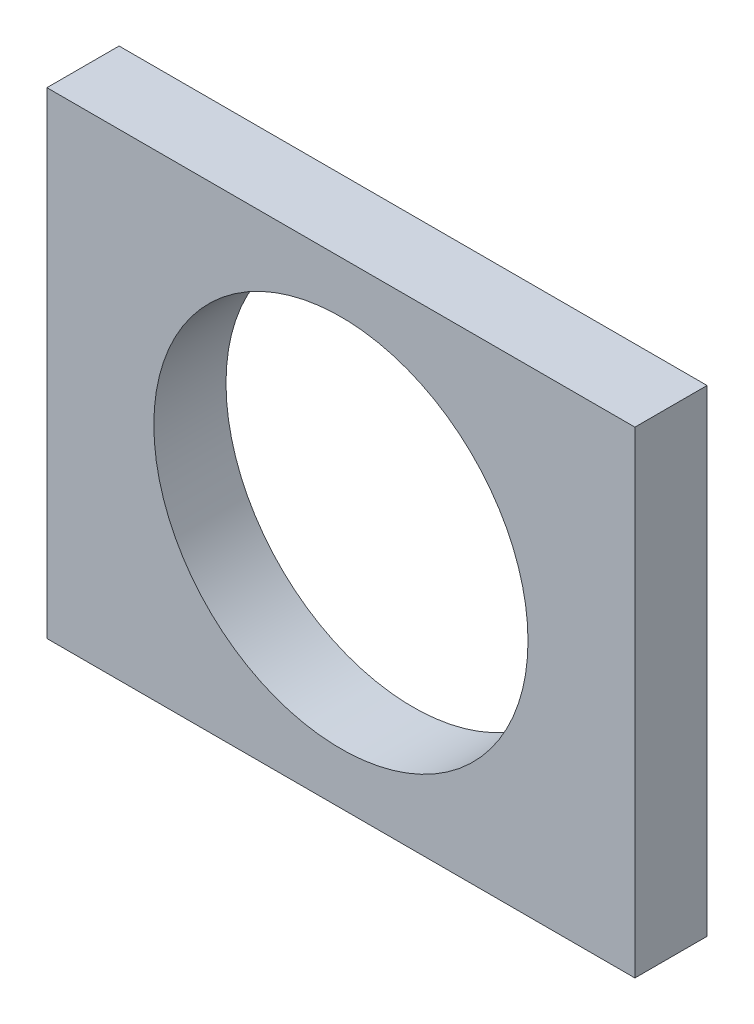
ISO-10303-21;
HEADER;
FILE_DESCRIPTION(('STEP AP214'),'2;1');
FILE_NAME('part.step','',(''),(''),'','','');
FILE_SCHEMA(('AUTOMOTIVE_DESIGN { 1 0 10303 214 1 1 1 1 }'));
ENDSEC;
DATA;
#1=APPLICATION_CONTEXT('core data for automotive mechanical design processes');
#2=APPLICATION_PROTOCOL_DEFINITION('international standard','automotive_design',2000,#1);
#3=PRODUCT_CONTEXT('',#1,'mechanical');
#4=PRODUCT('Part','Part','',(#3));
#5=PRODUCT_RELATED_PRODUCT_CATEGORY('part','',(#4));
#6=PRODUCT_DEFINITION_FORMATION('','',#4);
#7=PRODUCT_DEFINITION_CONTEXT('part definition',#1,'design');
#8=PRODUCT_DEFINITION('design','',#6,#7);
#9=PRODUCT_DEFINITION_SHAPE('','',#8);
#10=(LENGTH_UNIT() NAMED_UNIT(*) SI_UNIT(.MILLI.,.METRE.));
#11=(NAMED_UNIT(*) PLANE_ANGLE_UNIT() SI_UNIT($,.RADIAN.));
#12=(NAMED_UNIT(*) SI_UNIT($,.STERADIAN.) SOLID_ANGLE_UNIT());
#13=UNCERTAINTY_MEASURE_WITH_UNIT(LENGTH_MEASURE(1.E-05),#10,'distance_accuracy_value','');
#14=(GEOMETRIC_REPRESENTATION_CONTEXT(3) GLOBAL_UNCERTAINTY_ASSIGNED_CONTEXT((#13)) GLOBAL_UNIT_ASSIGNED_CONTEXT((#10,
#11,#12)) REPRESENTATION_CONTEXT('',''));
#15=CARTESIAN_POINT('',(0.,0.,0.));
#16=DIRECTION('',(0.,0.,1.));
#17=DIRECTION('',(1.,0.,0.));
#18=AXIS2_PLACEMENT_3D('',#15,#16,#17);
#19=CARTESIAN_POINT('',(0.,0.,5.4));
#20=DIRECTION('',(0.,0.,1.));
#21=DIRECTION('',(1.,0.,0.));
#22=AXIS2_PLACEMENT_3D('',#19,#20,#21);
#23=PLANE('',#22);
#24=DIRECTION('',(0.,1.,0.));
#25=VECTOR('',#24,1.);
#26=CARTESIAN_POINT('',(22.,17.85,5.4));
#27=LINE('',#26,#25);
#28=CARTESIAN_POINT('',(22.,-17.85,5.4));
#29=VERTEX_POINT('',#28);
#30=CARTESIAN_POINT('',(22.,17.85,5.4));
#31=VERTEX_POINT('',#30);
#32=EDGE_CURVE('E98',#29,#31,#27,.T.);
#33=ORIENTED_EDGE('',*,*,#32,.T.);
#34=DIRECTION('',(-1.,0.,0.));
#35=VECTOR('',#34,1.);
#36=CARTESIAN_POINT('',(-22.,17.85,5.4));
#37=LINE('',#36,#35);
#38=CARTESIAN_POINT('',(-22.,17.85,5.4));
#39=VERTEX_POINT('',#38);
#40=EDGE_CURVE('E93',#31,#39,#37,.T.);
#41=ORIENTED_EDGE('',*,*,#40,.T.);
#42=DIRECTION('',(0.,-1.,0.));
#43=VECTOR('',#42,1.);
#44=CARTESIAN_POINT('',(-22.,17.85,5.4));
#45=LINE('',#44,#43);
#46=CARTESIAN_POINT('',(-22.,-17.85,5.4));
#47=VERTEX_POINT('',#46);
#48=EDGE_CURVE('E96',#39,#47,#45,.T.);
#49=ORIENTED_EDGE('',*,*,#48,.T.);
#50=DIRECTION('',(1.,0.,0.));
#51=VECTOR('',#50,1.);
#52=CARTESIAN_POINT('',(-22.,-17.85,5.4));
#53=LINE('',#52,#51);
#54=EDGE_CURVE('E63',#47,#29,#53,.T.);
#55=ORIENTED_EDGE('',*,*,#54,.T.);
#56=EDGE_LOOP('',(#33,#41,#49,#55));
#57=FACE_BOUND('',#56,.T.);
#58=CARTESIAN_POINT('',(0.,0.,5.4));
#59=DIRECTION('',(0.,0.,1.));
#60=DIRECTION('',(1.,0.,0.));
#61=AXIS2_PLACEMENT_3D('',#58,#59,#60);
#62=CIRCLE('',#61,14.);
#63=CARTESIAN_POINT('',(-14.,0.,5.4));
#64=VERTEX_POINT('',#63);
#65=EDGE_CURVE('E118',#64,#64,#62,.T.);
#66=ORIENTED_EDGE('',*,*,#65,.F.);
#67=EDGE_LOOP('',(#66));
#68=FACE_BOUND('',#67,.T.);
#69=ADVANCED_FACE('F45',(#57,#68),#23,.T.);
#70=CARTESIAN_POINT('',(0.,0.,0.));
#71=DIRECTION('',(0.,0.,1.));
#72=DIRECTION('',(1.,0.,0.));
#73=AXIS2_PLACEMENT_3D('',#70,#71,#72);
#74=PLANE('',#73);
#75=DIRECTION('',(0.,1.,0.));
#76=VECTOR('',#75,1.);
#77=CARTESIAN_POINT('',(22.,17.85,0.));
#78=LINE('',#77,#76);
#79=CARTESIAN_POINT('',(22.,-17.85,0.));
#80=VERTEX_POINT('',#79);
#81=CARTESIAN_POINT('',(22.,17.85,0.));
#82=VERTEX_POINT('',#81);
#83=EDGE_CURVE('E114',#80,#82,#78,.T.);
#84=ORIENTED_EDGE('',*,*,#83,.F.);
#85=DIRECTION('',(1.,0.,0.));
#86=VECTOR('',#85,1.);
#87=CARTESIAN_POINT('',(-22.,-17.85,0.));
#88=LINE('',#87,#86);
#89=CARTESIAN_POINT('',(-22.,-17.85,0.));
#90=VERTEX_POINT('',#89);
#91=EDGE_CURVE('E86',#90,#80,#88,.T.);
#92=ORIENTED_EDGE('',*,*,#91,.F.);
#93=DIRECTION('',(0.,-1.,0.));
#94=VECTOR('',#93,1.);
#95=CARTESIAN_POINT('',(-22.,17.85,0.));
#96=LINE('',#95,#94);
#97=CARTESIAN_POINT('',(-22.,17.85,0.));
#98=VERTEX_POINT('',#97);
#99=EDGE_CURVE('E80',#98,#90,#96,.T.);
#100=ORIENTED_EDGE('',*,*,#99,.F.);
#101=DIRECTION('',(-1.,0.,0.));
#102=VECTOR('',#101,1.);
#103=CARTESIAN_POINT('',(-22.,17.85,0.));
#104=LINE('',#103,#102);
#105=EDGE_CURVE('E103',#82,#98,#104,.T.);
#106=ORIENTED_EDGE('',*,*,#105,.F.);
#107=EDGE_LOOP('',(#84,#92,#100,#106));
#108=FACE_BOUND('',#107,.T.);
#109=CARTESIAN_POINT('',(0.,0.,0.));
#110=DIRECTION('',(0.,0.,1.));
#111=DIRECTION('',(1.,0.,0.));
#112=AXIS2_PLACEMENT_3D('',#109,#110,#111);
#113=CIRCLE('',#112,14.);
#114=CARTESIAN_POINT('',(-14.,0.,0.));
#115=VERTEX_POINT('',#114);
#116=EDGE_CURVE('E136',#115,#115,#113,.T.);
#117=ORIENTED_EDGE('',*,*,#116,.T.);
#118=EDGE_LOOP('',(#117));
#119=FACE_BOUND('',#118,.T.);
#120=ADVANCED_FACE('F131',(#108,#119),#74,.F.);
#121=CARTESIAN_POINT('',(22.,17.85,5.4));
#122=DIRECTION('',(-1.,0.,0.));
#123=DIRECTION('',(0.,-1.,0.));
#124=AXIS2_PLACEMENT_3D('',#121,#122,#123);
#125=PLANE('',#124);
#126=ORIENTED_EDGE('',*,*,#83,.T.);
#127=DIRECTION('',(0.,0.,-1.));
#128=VECTOR('',#127,1.);
#129=CARTESIAN_POINT('',(22.,17.85,5.4));
#130=LINE('',#129,#128);
#131=EDGE_CURVE('E11',#31,#82,#130,.T.);
#132=ORIENTED_EDGE('',*,*,#131,.F.);
#133=ORIENTED_EDGE('',*,*,#32,.F.);
#134=DIRECTION('',(0.,0.,-1.));
#135=VECTOR('',#134,1.);
#136=CARTESIAN_POINT('',(22.,-17.85,5.4));
#137=LINE('',#136,#135);
#138=EDGE_CURVE('E110',#29,#80,#137,.T.);
#139=ORIENTED_EDGE('',*,*,#138,.T.);
#140=EDGE_LOOP('',(#126,#132,#133,#139));
#141=FACE_BOUND('',#140,.T.);
#142=ADVANCED_FACE('F47',(#141),#125,.F.);
#143=CARTESIAN_POINT('',(-22.,17.85,5.4));
#144=DIRECTION('',(0.,-1.,0.));
#145=DIRECTION('',(0.,0.,-1.));
#146=AXIS2_PLACEMENT_3D('',#143,#144,#145);
#147=PLANE('',#146);
#148=ORIENTED_EDGE('',*,*,#105,.T.);
#149=DIRECTION('',(0.,0.,-1.));
#150=VECTOR('',#149,1.);
#151=CARTESIAN_POINT('',(-22.,17.85,5.4));
#152=LINE('',#151,#150);
#153=EDGE_CURVE('E55',#39,#98,#152,.T.);
#154=ORIENTED_EDGE('',*,*,#153,.F.);
#155=ORIENTED_EDGE('',*,*,#40,.F.);
#156=ORIENTED_EDGE('',*,*,#131,.T.);
#157=EDGE_LOOP('',(#148,#154,#155,#156));
#158=FACE_BOUND('',#157,.T.);
#159=ADVANCED_FACE('F102',(#158),#147,.F.);
#160=CARTESIAN_POINT('',(-22.,17.85,5.4));
#161=DIRECTION('',(1.,0.,0.));
#162=DIRECTION('',(0.,0.,-1.));
#163=AXIS2_PLACEMENT_3D('',#160,#161,#162);
#164=PLANE('',#163);
#165=ORIENTED_EDGE('',*,*,#99,.T.);
#166=DIRECTION('',(0.,0.,-1.));
#167=VECTOR('',#166,1.);
#168=CARTESIAN_POINT('',(-22.,-17.85,5.4));
#169=LINE('',#168,#167);
#170=EDGE_CURVE('E105',#47,#90,#169,.T.);
#171=ORIENTED_EDGE('',*,*,#170,.F.);
#172=ORIENTED_EDGE('',*,*,#48,.F.);
#173=ORIENTED_EDGE('',*,*,#153,.T.);
#174=EDGE_LOOP('',(#165,#171,#172,#173));
#175=FACE_BOUND('',#174,.T.);
#176=ADVANCED_FACE('F106',(#175),#164,.F.);
#177=CARTESIAN_POINT('',(-22.,-17.85,5.4));
#178=DIRECTION('',(0.,1.,0.));
#179=DIRECTION('',(0.,0.,1.));
#180=AXIS2_PLACEMENT_3D('',#177,#178,#179);
#181=PLANE('',#180);
#182=ORIENTED_EDGE('',*,*,#91,.T.);
#183=ORIENTED_EDGE('',*,*,#138,.F.);
#184=ORIENTED_EDGE('',*,*,#54,.F.);
#185=ORIENTED_EDGE('',*,*,#170,.T.);
#186=EDGE_LOOP('',(#182,#183,#184,#185));
#187=FACE_BOUND('',#186,.T.);
#188=ADVANCED_FACE('F128',(#187),#181,.F.);
#189=CARTESIAN_POINT('',(0.,0.,5.4));
#190=DIRECTION('',(0.,0.,-1.));
#191=DIRECTION('',(-1.,0.,0.));
#192=AXIS2_PLACEMENT_3D('',#189,#190,#191);
#193=CYLINDRICAL_SURFACE('',#192,14.);
#194=CARTESIAN_POINT('',(-14.,0.,5.4));
#195=CARTESIAN_POINT('',(-14.,0.,5.34375));
#196=CARTESIAN_POINT('',(-14.,0.,5.2875));
#197=CARTESIAN_POINT('',(-14.,0.,5.175));
#198=CARTESIAN_POINT('',(-14.,0.,5.11875));
#199=CARTESIAN_POINT('',(-14.,0.,5.00625));
#200=CARTESIAN_POINT('',(-14.,0.,4.95));
#201=CARTESIAN_POINT('',(-14.,0.,4.8375));
#202=CARTESIAN_POINT('',(-14.,0.,4.78125));
#203=CARTESIAN_POINT('',(-14.,0.,4.66875));
#204=CARTESIAN_POINT('',(-14.,0.,4.6125));
#205=CARTESIAN_POINT('',(-14.,0.,4.5));
#206=CARTESIAN_POINT('',(-14.,0.,4.44375));
#207=CARTESIAN_POINT('',(-14.,0.,4.33125));
#208=CARTESIAN_POINT('',(-14.,0.,4.275));
#209=CARTESIAN_POINT('',(-14.,0.,4.1625));
#210=CARTESIAN_POINT('',(-14.,0.,4.10625));
#211=CARTESIAN_POINT('',(-14.,0.,3.99375));
#212=CARTESIAN_POINT('',(-14.,0.,3.9375));
#213=CARTESIAN_POINT('',(-14.,0.,3.825));
#214=CARTESIAN_POINT('',(-14.,0.,3.76875));
#215=CARTESIAN_POINT('',(-14.,0.,3.65625));
#216=CARTESIAN_POINT('',(-14.,0.,3.6));
#217=CARTESIAN_POINT('',(-14.,0.,3.4875));
#218=CARTESIAN_POINT('',(-14.,0.,3.43125));
#219=CARTESIAN_POINT('',(-14.,0.,3.31875));
#220=CARTESIAN_POINT('',(-14.,0.,3.2625));
#221=CARTESIAN_POINT('',(-14.,0.,3.15));
#222=CARTESIAN_POINT('',(-14.,0.,3.09375));
#223=CARTESIAN_POINT('',(-14.,0.,2.98125));
#224=CARTESIAN_POINT('',(-14.,0.,2.925));
#225=CARTESIAN_POINT('',(-14.,0.,2.8125));
#226=CARTESIAN_POINT('',(-14.,0.,2.75625));
#227=CARTESIAN_POINT('',(-14.,0.,2.64375));
#228=CARTESIAN_POINT('',(-14.,0.,2.5875));
#229=CARTESIAN_POINT('',(-14.,0.,2.475));
#230=CARTESIAN_POINT('',(-14.,0.,2.41875));
#231=CARTESIAN_POINT('',(-14.,0.,2.30625));
#232=CARTESIAN_POINT('',(-14.,0.,2.25));
#233=CARTESIAN_POINT('',(-14.,0.,2.1375));
#234=CARTESIAN_POINT('',(-14.,0.,2.08125));
#235=CARTESIAN_POINT('',(-14.,0.,1.96875));
#236=CARTESIAN_POINT('',(-14.,0.,1.9125));
#237=CARTESIAN_POINT('',(-14.,0.,1.8));
#238=CARTESIAN_POINT('',(-14.,0.,1.74375));
#239=CARTESIAN_POINT('',(-14.,0.,1.63125));
#240=CARTESIAN_POINT('',(-14.,0.,1.575));
#241=CARTESIAN_POINT('',(-14.,0.,1.4625));
#242=CARTESIAN_POINT('',(-14.,0.,1.40625));
#243=CARTESIAN_POINT('',(-14.,0.,1.29375));
#244=CARTESIAN_POINT('',(-14.,0.,1.2375));
#245=CARTESIAN_POINT('',(-14.,0.,1.125));
#246=CARTESIAN_POINT('',(-14.,0.,1.06875));
#247=CARTESIAN_POINT('',(-14.,0.,0.956249999999999));
#248=CARTESIAN_POINT('',(-14.,0.,0.899999999999999));
#249=CARTESIAN_POINT('',(-14.,0.,0.787499999999999));
#250=CARTESIAN_POINT('',(-14.,0.,0.731249999999999));
#251=CARTESIAN_POINT('',(-14.,0.,0.618749999999999));
#252=CARTESIAN_POINT('',(-14.,0.,0.562499999999999));
#253=CARTESIAN_POINT('',(-14.,0.,0.449999999999999));
#254=CARTESIAN_POINT('',(-14.,0.,0.393749999999999));
#255=CARTESIAN_POINT('',(-14.,0.,0.281249999999999));
#256=CARTESIAN_POINT('',(-14.,0.,0.224999999999999));
#257=CARTESIAN_POINT('',(-14.,0.,0.112499999999999));
#258=CARTESIAN_POINT('',(-14.,0.,0.0562499999999989));
#259=CARTESIAN_POINT('',(-14.,0.,0.));
#260=B_SPLINE_CURVE_WITH_KNOTS('',3,(#194,#195,#196,#197,#198,#199,#200,#201,#202,#203,#204,
#205,#206,#207,#208,#209,#210,#211,#212,#213,#214,#215,#216,#217,#218,#219,#220,#221,#222,#223,
#224,#225,#226,#227,#228,#229,#230,#231,#232,#233,#234,#235,#236,#237,#238,#239,#240,#241,#242,
#243,#244,#245,#246,#247,#248,#249,#250,#251,#252,#253,#254,#255,#256,#257,#258,#259),
.UNSPECIFIED.,.F.,.F.,(4,2,2,2,2,2,2,2,2,2,2,2,2,2,2,2,2,2,2,2,2,2,2,2,2,2,2,2,2,2,2,2,4),(0.,
0.16875,0.337499999999999,0.50625,0.674999999999999,0.84375,1.0125,1.18125,1.35,1.51875,1.6875,
1.85625,2.025,2.19375,2.3625,2.53125,2.7,2.86875,3.0375,3.20625,3.375,3.54375,3.7125,3.88125,
4.05,4.21875,4.3875,4.55625,4.725,4.89375,5.0625,5.23125,5.4),.UNSPECIFIED.);
#261=EDGE_CURVE('BSEAM144',#64,#115,#260,.T.);
#262=ORIENTED_EDGE('',*,*,#65,.T.);
#263=ORIENTED_EDGE('',*,*,#116,.F.);
#264=ORIENTED_EDGE('',*,*,#261,.T.);
#265=ORIENTED_EDGE('',*,*,#261,.F.);
#266=EDGE_LOOP('',(#262,#264,#263,#265));
#267=FACE_BOUND('',#266,.T.);
#268=ADVANCED_FACE('F144',(#267),#193,.F.);
#269=CLOSED_SHELL('',(#69,#120,#142,#159,#176,#188,#268));
#270=MANIFOLD_SOLID_BREP('B2',#269);
#271=ADVANCED_BREP_SHAPE_REPRESENTATION('',(#18,#270),#14);
#272=SHAPE_DEFINITION_REPRESENTATION(#9,#271);
ENDSEC;
END-ISO-10303-21;
